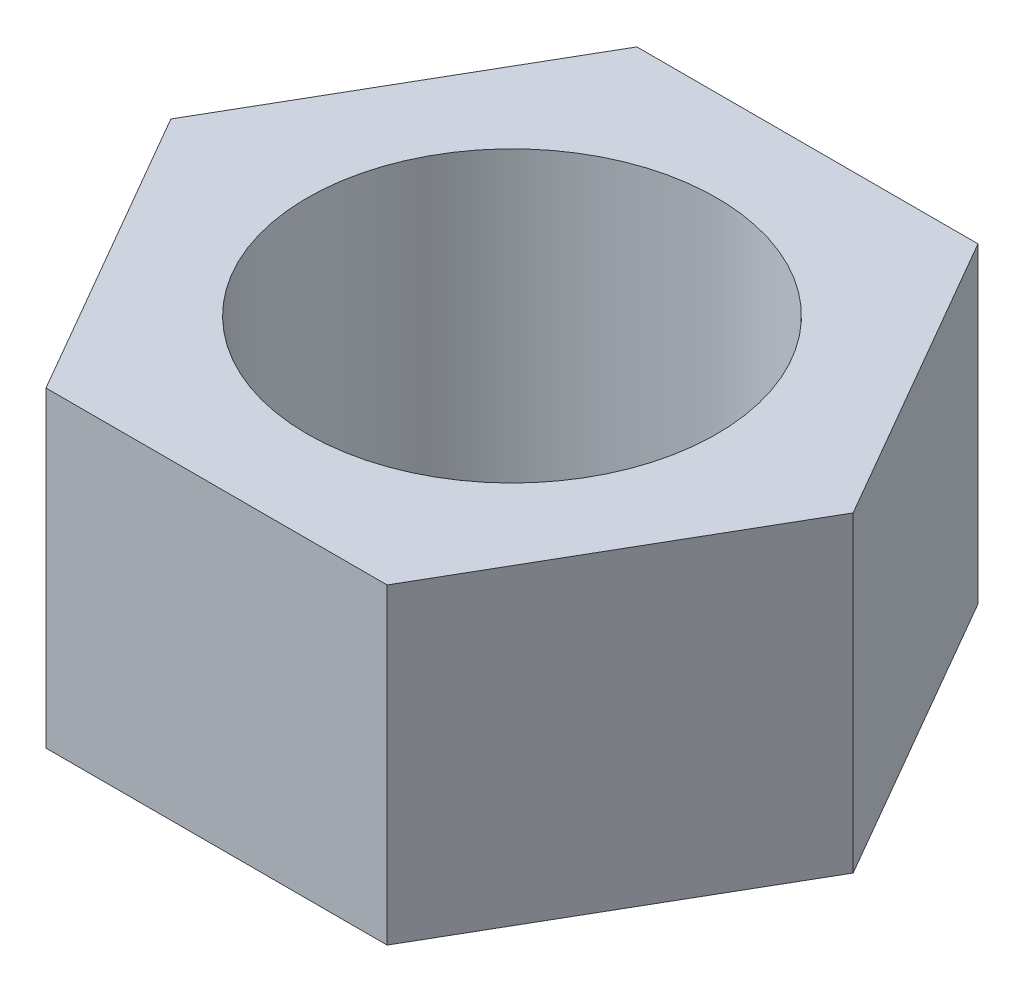
ISO-10303-21;
HEADER;
FILE_DESCRIPTION(('STEP AP214'),'2;1');
FILE_NAME('part.step','',(''),(''),'','','');
FILE_SCHEMA(('AUTOMOTIVE_DESIGN { 1 0 10303 214 1 1 1 1 }'));
ENDSEC;
DATA;
#1=APPLICATION_CONTEXT('core data for automotive mechanical design processes');
#2=APPLICATION_PROTOCOL_DEFINITION('international standard','automotive_design',2000,#1);
#3=PRODUCT_CONTEXT('',#1,'mechanical');
#4=PRODUCT('Part','Part','',(#3));
#5=PRODUCT_RELATED_PRODUCT_CATEGORY('part','',(#4));
#6=PRODUCT_DEFINITION_FORMATION('','',#4);
#7=PRODUCT_DEFINITION_CONTEXT('part definition',#1,'design');
#8=PRODUCT_DEFINITION('design','',#6,#7);
#9=PRODUCT_DEFINITION_SHAPE('','',#8);
#10=(LENGTH_UNIT() NAMED_UNIT(*) SI_UNIT(.MILLI.,.METRE.));
#11=(NAMED_UNIT(*) PLANE_ANGLE_UNIT() SI_UNIT($,.RADIAN.));
#12=(NAMED_UNIT(*) SI_UNIT($,.STERADIAN.) SOLID_ANGLE_UNIT());
#13=UNCERTAINTY_MEASURE_WITH_UNIT(LENGTH_MEASURE(1.E-05),#10,'distance_accuracy_value','');
#14=(GEOMETRIC_REPRESENTATION_CONTEXT(3) GLOBAL_UNCERTAINTY_ASSIGNED_CONTEXT((#13)) GLOBAL_UNIT_ASSIGNED_CONTEXT((#10,
#11,#12)) REPRESENTATION_CONTEXT('',''));
#15=CARTESIAN_POINT('',(0.,0.,0.));
#16=DIRECTION('',(0.,0.,1.));
#17=DIRECTION('',(1.,0.,0.));
#18=AXIS2_PLACEMENT_3D('',#15,#16,#17);
#19=CARTESIAN_POINT('',(0.,3200.,0.));
#20=DIRECTION('',(0.,1.,0.));
#21=DIRECTION('',(0.,0.,1.));
#22=AXIS2_PLACEMENT_3D('',#19,#20,#21);
#23=PLANE('',#22);
#24=DIRECTION('',(0.499999999999995,0.,-0.866025403784441));
#25=VECTOR('',#24,1.);
#26=CARTESIAN_POINT('',(1750.00000000004,3200.,3031.08891324551));
#27=LINE('',#26,#25);
#28=CARTESIAN_POINT('',(1750.00000000004,3200.,3031.08891324551));
#29=VERTEX_POINT('',#28);
#30=CARTESIAN_POINT('',(3500.,3200.,0.));
#31=VERTEX_POINT('',#30);
#32=EDGE_CURVE('E152',#29,#31,#27,.T.);
#33=ORIENTED_EDGE('',*,*,#32,.T.);
#34=DIRECTION('',(-0.500000000000001,0.,-0.866025403784438));
#35=VECTOR('',#34,1.);
#36=CARTESIAN_POINT('',(3500.,3200.,0.));
#37=LINE('',#36,#35);
#38=CARTESIAN_POINT('',(1749.99999999999,3200.,-3031.08891324554));
#39=VERTEX_POINT('',#38);
#40=EDGE_CURVE('E100',#31,#39,#37,.T.);
#41=ORIENTED_EDGE('',*,*,#40,.T.);
#42=DIRECTION('',(-1.,0.,0.));
#43=VECTOR('',#42,1.);
#44=CARTESIAN_POINT('',(1749.99999999999,3200.,-3031.08891324554));
#45=LINE('',#44,#43);
#46=CARTESIAN_POINT('',(-1750.00000000001,3200.,-3031.08891324553));
#47=VERTEX_POINT('',#46);
#48=EDGE_CURVE('E113',#39,#47,#45,.T.);
#49=ORIENTED_EDGE('',*,*,#48,.T.);
#50=DIRECTION('',(-0.499999999999995,0.,0.866025403784442));
#51=VECTOR('',#50,1.);
#52=CARTESIAN_POINT('',(-1750.00000000001,3200.,-3031.08891324553));
#53=LINE('',#52,#51);
#54=CARTESIAN_POINT('',(-3500.,3200.,2.44403693719019E-11));
#55=VERTEX_POINT('',#54);
#56=EDGE_CURVE('E107',#47,#55,#53,.T.);
#57=ORIENTED_EDGE('',*,*,#56,.T.);
#58=DIRECTION('',(0.500000000000007,0.,0.866025403784434));
#59=VECTOR('',#58,1.);
#60=CARTESIAN_POINT('',(-3500.,3200.,2.44403693719019E-11));
#61=LINE('',#60,#59);
#62=CARTESIAN_POINT('',(-1749.99999999997,3200.,3031.08891324555));
#63=VERTEX_POINT('',#62);
#64=EDGE_CURVE('E111',#55,#63,#61,.T.);
#65=ORIENTED_EDGE('',*,*,#64,.T.);
#66=DIRECTION('',(1.,0.,0.));
#67=VECTOR('',#66,1.);
#68=CARTESIAN_POINT('',(-1749.99999999997,3200.,3031.08891324555));
#69=LINE('',#68,#67);
#70=EDGE_CURVE('E63',#63,#29,#69,.T.);
#71=ORIENTED_EDGE('',*,*,#70,.T.);
#72=EDGE_LOOP('',(#33,#41,#49,#57,#65,#71));
#73=FACE_BOUND('',#72,.T.);
#74=CARTESIAN_POINT('',(0.,3200.,0.));
#75=DIRECTION('',(0.,1.,0.));
#76=DIRECTION('',(0.,0.,1.));
#77=AXIS2_PLACEMENT_3D('',#74,#75,#76);
#78=CIRCLE('',#77,2100.);
#79=CARTESIAN_POINT('',(0.,3200.,2100.));
#80=VERTEX_POINT('',#79);
#81=EDGE_CURVE('E140',#80,#80,#78,.T.);
#82=ORIENTED_EDGE('',*,*,#81,.F.);
#83=EDGE_LOOP('',(#82));
#84=FACE_BOUND('',#83,.T.);
#85=ADVANCED_FACE('F45',(#73,#84),#23,.T.);
#86=CARTESIAN_POINT('',(0.,0.,0.));
#87=DIRECTION('',(0.,1.,0.));
#88=DIRECTION('',(0.,0.,1.));
#89=AXIS2_PLACEMENT_3D('',#86,#87,#88);
#90=PLANE('',#89);
#91=DIRECTION('',(0.499999999999995,0.,-0.866025403784441));
#92=VECTOR('',#91,1.);
#93=CARTESIAN_POINT('',(1750.00000000004,0.,3031.08891324551));
#94=LINE('',#93,#92);
#95=CARTESIAN_POINT('',(1750.00000000004,0.,3031.08891324551));
#96=VERTEX_POINT('',#95);
#97=CARTESIAN_POINT('',(3500.,0.,0.));
#98=VERTEX_POINT('',#97);
#99=EDGE_CURVE('E135',#96,#98,#94,.T.);
#100=ORIENTED_EDGE('',*,*,#99,.F.);
#101=DIRECTION('',(1.,0.,0.));
#102=VECTOR('',#101,1.);
#103=CARTESIAN_POINT('',(-1749.99999999997,0.,3031.08891324555));
#104=LINE('',#103,#102);
#105=CARTESIAN_POINT('',(-1749.99999999997,0.,3031.08891324555));
#106=VERTEX_POINT('',#105);
#107=EDGE_CURVE('E92',#106,#96,#104,.T.);
#108=ORIENTED_EDGE('',*,*,#107,.F.);
#109=DIRECTION('',(0.500000000000007,0.,0.866025403784434));
#110=VECTOR('',#109,1.);
#111=CARTESIAN_POINT('',(-3500.,0.,2.44403693719019E-11));
#112=LINE('',#111,#110);
#113=CARTESIAN_POINT('',(-3500.,0.,2.44403693719019E-11));
#114=VERTEX_POINT('',#113);
#115=EDGE_CURVE('E86',#114,#106,#112,.T.);
#116=ORIENTED_EDGE('',*,*,#115,.F.);
#117=DIRECTION('',(-0.499999999999995,0.,0.866025403784442));
#118=VECTOR('',#117,1.);
#119=CARTESIAN_POINT('',(-1750.00000000001,0.,-3031.08891324553));
#120=LINE('',#119,#118);
#121=CARTESIAN_POINT('',(-1750.00000000001,0.,-3031.08891324553));
#122=VERTEX_POINT('',#121);
#123=EDGE_CURVE('E122',#122,#114,#120,.T.);
#124=ORIENTED_EDGE('',*,*,#123,.F.);
#125=DIRECTION('',(-1.,0.,0.));
#126=VECTOR('',#125,1.);
#127=CARTESIAN_POINT('',(1749.99999999999,0.,-3031.08891324554));
#128=LINE('',#127,#126);
#129=CARTESIAN_POINT('',(1749.99999999999,0.,-3031.08891324554));
#130=VERTEX_POINT('',#129);
#131=EDGE_CURVE('E143',#130,#122,#128,.T.);
#132=ORIENTED_EDGE('',*,*,#131,.F.);
#133=DIRECTION('',(-0.500000000000001,0.,-0.866025403784438));
#134=VECTOR('',#133,1.);
#135=CARTESIAN_POINT('',(3500.,0.,0.));
#136=LINE('',#135,#134);
#137=EDGE_CURVE('E139',#98,#130,#136,.T.);
#138=ORIENTED_EDGE('',*,*,#137,.F.);
#139=EDGE_LOOP('',(#100,#108,#116,#124,#132,#138));
#140=FACE_BOUND('',#139,.T.);
#141=CARTESIAN_POINT('',(0.,0.,0.));
#142=DIRECTION('',(0.,1.,0.));
#143=DIRECTION('',(0.,0.,1.));
#144=AXIS2_PLACEMENT_3D('',#141,#142,#143);
#145=CIRCLE('',#144,2100.);
#146=CARTESIAN_POINT('',(0.,0.,2100.));
#147=VERTEX_POINT('',#146);
#148=EDGE_CURVE('E249',#147,#147,#145,.T.);
#149=ORIENTED_EDGE('',*,*,#148,.T.);
#150=EDGE_LOOP('',(#149));
#151=FACE_BOUND('',#150,.T.);
#152=ADVANCED_FACE('F165',(#140,#151),#90,.F.);
#153=CARTESIAN_POINT('',(1750.00000000004,3200.,3031.08891324551));
#154=DIRECTION('',(-0.866025403784442,0.,-0.499999999999995));
#155=DIRECTION('',(-0.499999999999995,0.,0.866025403784442));
#156=AXIS2_PLACEMENT_3D('',#153,#154,#155);
#157=PLANE('',#156);
#158=ORIENTED_EDGE('',*,*,#99,.T.);
#159=DIRECTION('',(0.,-1.,0.));
#160=VECTOR('',#159,1.);
#161=CARTESIAN_POINT('',(3500.,3200.,0.));
#162=LINE('',#161,#160);
#163=EDGE_CURVE('E11',#31,#98,#162,.T.);
#164=ORIENTED_EDGE('',*,*,#163,.F.);
#165=ORIENTED_EDGE('',*,*,#32,.F.);
#166=DIRECTION('',(0.,-1.,0.));
#167=VECTOR('',#166,1.);
#168=CARTESIAN_POINT('',(1750.00000000004,3200.,3031.08891324551));
#169=LINE('',#168,#167);
#170=EDGE_CURVE('E131',#29,#96,#169,.T.);
#171=ORIENTED_EDGE('',*,*,#170,.T.);
#172=EDGE_LOOP('',(#158,#164,#165,#171));
#173=FACE_BOUND('',#172,.T.);
#174=ADVANCED_FACE('F47',(#173),#157,.F.);
#175=CARTESIAN_POINT('',(3500.,3200.,0.));
#176=DIRECTION('',(-0.866025403784438,0.,0.500000000000001));
#177=DIRECTION('',(0.500000000000001,0.,0.866025403784438));
#178=AXIS2_PLACEMENT_3D('',#175,#176,#177);
#179=PLANE('',#178);
#180=ORIENTED_EDGE('',*,*,#137,.T.);
#181=DIRECTION('',(0.,-1.,0.));
#182=VECTOR('',#181,1.);
#183=CARTESIAN_POINT('',(1749.99999999999,3200.,-3031.08891324554));
#184=LINE('',#183,#182);
#185=EDGE_CURVE('E55',#39,#130,#184,.T.);
#186=ORIENTED_EDGE('',*,*,#185,.F.);
#187=ORIENTED_EDGE('',*,*,#40,.F.);
#188=ORIENTED_EDGE('',*,*,#163,.T.);
#189=EDGE_LOOP('',(#180,#186,#187,#188));
#190=FACE_BOUND('',#189,.T.);
#191=ADVANCED_FACE('F190',(#190),#179,.F.);
#192=CARTESIAN_POINT('',(1749.99999999999,3200.,-3031.08891324554));
#193=DIRECTION('',(0.,0.,1.));
#194=DIRECTION('',(1.,0.,0.));
#195=AXIS2_PLACEMENT_3D('',#192,#193,#194);
#196=PLANE('',#195);
#197=ORIENTED_EDGE('',*,*,#131,.T.);
#198=DIRECTION('',(0.,-1.,0.));
#199=VECTOR('',#198,1.);
#200=CARTESIAN_POINT('',(-1750.00000000001,3200.,-3031.08891324553));
#201=LINE('',#200,#199);
#202=EDGE_CURVE('E124',#47,#122,#201,.T.);
#203=ORIENTED_EDGE('',*,*,#202,.F.);
#204=ORIENTED_EDGE('',*,*,#48,.F.);
#205=ORIENTED_EDGE('',*,*,#185,.T.);
#206=EDGE_LOOP('',(#197,#203,#204,#205));
#207=FACE_BOUND('',#206,.T.);
#208=ADVANCED_FACE('F162',(#207),#196,.F.);
#209=CARTESIAN_POINT('',(-1750.00000000001,3200.,-3031.08891324553));
#210=DIRECTION('',(0.866025403784442,0.,0.499999999999995));
#211=DIRECTION('',(0.499999999999995,0.,-0.866025403784441));
#212=AXIS2_PLACEMENT_3D('',#209,#210,#211);
#213=PLANE('',#212);
#214=ORIENTED_EDGE('',*,*,#123,.T.);
#215=DIRECTION('',(0.,-1.,0.));
#216=VECTOR('',#215,1.);
#217=CARTESIAN_POINT('',(-3500.,3200.,2.44403693719019E-11));
#218=LINE('',#217,#216);
#219=EDGE_CURVE('E119',#55,#114,#218,.T.);
#220=ORIENTED_EDGE('',*,*,#219,.F.);
#221=ORIENTED_EDGE('',*,*,#56,.F.);
#222=ORIENTED_EDGE('',*,*,#202,.T.);
#223=EDGE_LOOP('',(#214,#220,#221,#222));
#224=FACE_BOUND('',#223,.T.);
#225=ADVANCED_FACE('F120',(#224),#213,.F.);
#226=CARTESIAN_POINT('',(-3500.,3200.,2.44403693719019E-11));
#227=DIRECTION('',(0.866025403784435,0.,-0.500000000000007));
#228=DIRECTION('',(-0.500000000000007,0.,-0.866025403784435));
#229=AXIS2_PLACEMENT_3D('',#226,#227,#228);
#230=PLANE('',#229);
#231=ORIENTED_EDGE('',*,*,#115,.T.);
#232=DIRECTION('',(0.,-1.,0.));
#233=VECTOR('',#232,1.);
#234=CARTESIAN_POINT('',(-1749.99999999997,3200.,3031.08891324555));
#235=LINE('',#234,#233);
#236=EDGE_CURVE('E125',#63,#106,#235,.T.);
#237=ORIENTED_EDGE('',*,*,#236,.F.);
#238=ORIENTED_EDGE('',*,*,#64,.F.);
#239=ORIENTED_EDGE('',*,*,#219,.T.);
#240=EDGE_LOOP('',(#231,#237,#238,#239));
#241=FACE_BOUND('',#240,.T.);
#242=ADVANCED_FACE('F127',(#241),#230,.F.);
#243=CARTESIAN_POINT('',(-1749.99999999997,3200.,3031.08891324555));
#244=DIRECTION('',(0.,0.,-1.));
#245=DIRECTION('',(-1.,0.,0.));
#246=AXIS2_PLACEMENT_3D('',#243,#244,#245);
#247=PLANE('',#246);
#248=ORIENTED_EDGE('',*,*,#107,.T.);
#249=ORIENTED_EDGE('',*,*,#170,.F.);
#250=ORIENTED_EDGE('',*,*,#70,.F.);
#251=ORIENTED_EDGE('',*,*,#236,.T.);
#252=EDGE_LOOP('',(#248,#249,#250,#251));
#253=FACE_BOUND('',#252,.T.);
#254=ADVANCED_FACE('F170',(#253),#247,.F.);
#255=CARTESIAN_POINT('',(0.,3200.,0.));
#256=DIRECTION('',(0.,-1.,0.));
#257=DIRECTION('',(0.,0.,-1.));
#258=AXIS2_PLACEMENT_3D('',#255,#256,#257);
#259=CYLINDRICAL_SURFACE('',#258,2100.);
#260=ORIENTED_EDGE('',*,*,#81,.T.);
#261=EDGE_LOOP('',(#260));
#262=FACE_BOUND('',#261,.T.);
#263=ORIENTED_EDGE('',*,*,#148,.F.);
#264=EDGE_LOOP('',(#263));
#265=FACE_BOUND('',#264,.T.);
#266=ADVANCED_FACE('F172',(#262,#265),#259,.F.);
#267=CLOSED_SHELL('',(#85,#152,#174,#191,#208,#225,#242,#254,#266));
#268=MANIFOLD_SOLID_BREP('B2',#267);
#269=ADVANCED_BREP_SHAPE_REPRESENTATION('',(#18,#268),#14);
#270=SHAPE_DEFINITION_REPRESENTATION(#9,#269);
ENDSEC;
END-ISO-10303-21;
